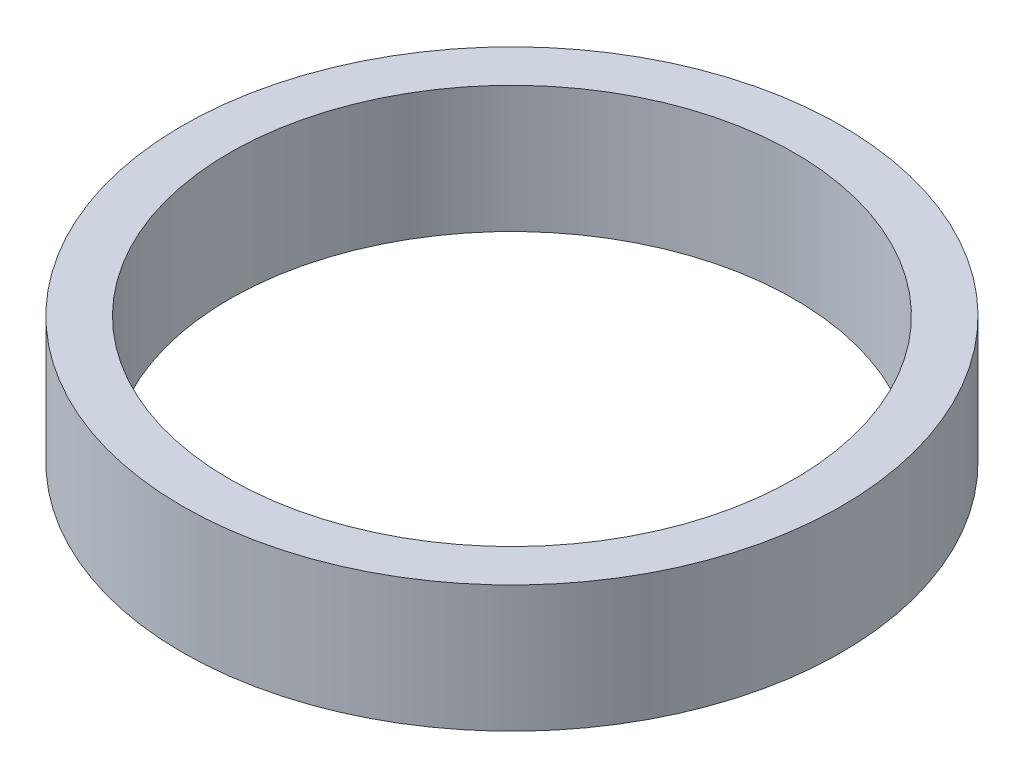
ISO-10303-21;
HEADER;
FILE_DESCRIPTION(('STEP AP214'),'2;1');
FILE_NAME('part.step','',(''),(''),'','','');
FILE_SCHEMA(('AUTOMOTIVE_DESIGN { 1 0 10303 214 1 1 1 1 }'));
ENDSEC;
DATA;
#1=APPLICATION_CONTEXT('core data for automotive mechanical design processes');
#2=APPLICATION_PROTOCOL_DEFINITION('international standard','automotive_design',2000,#1);
#3=PRODUCT_CONTEXT('',#1,'mechanical');
#4=PRODUCT('Part','Part','',(#3));
#5=PRODUCT_RELATED_PRODUCT_CATEGORY('part','',(#4));
#6=PRODUCT_DEFINITION_FORMATION('','',#4);
#7=PRODUCT_DEFINITION_CONTEXT('part definition',#1,'design');
#8=PRODUCT_DEFINITION('design','',#6,#7);
#9=PRODUCT_DEFINITION_SHAPE('','',#8);
#10=(LENGTH_UNIT() NAMED_UNIT(*) SI_UNIT(.MILLI.,.METRE.));
#11=(NAMED_UNIT(*) PLANE_ANGLE_UNIT() SI_UNIT($,.RADIAN.));
#12=(NAMED_UNIT(*) SI_UNIT($,.STERADIAN.) SOLID_ANGLE_UNIT());
#13=UNCERTAINTY_MEASURE_WITH_UNIT(LENGTH_MEASURE(1.E-05),#10,'distance_accuracy_value','');
#14=(GEOMETRIC_REPRESENTATION_CONTEXT(3) GLOBAL_UNCERTAINTY_ASSIGNED_CONTEXT((#13)) GLOBAL_UNIT_ASSIGNED_CONTEXT((#10,
#11,#12)) REPRESENTATION_CONTEXT('',''));
#15=CARTESIAN_POINT('',(0.,0.,0.));
#16=DIRECTION('',(0.,0.,1.));
#17=DIRECTION('',(1.,0.,0.));
#18=AXIS2_PLACEMENT_3D('',#15,#16,#17);
#19=CARTESIAN_POINT('',(0.,0.,0.));
#20=DIRECTION('',(0.,1.,0.));
#21=DIRECTION('',(0.,0.,1.));
#22=AXIS2_PLACEMENT_3D('',#19,#20,#21);
#23=CYLINDRICAL_SURFACE('',#22,6.);
#24=CARTESIAN_POINT('',(0.,4.25,0.));
#25=DIRECTION('',(0.,1.,0.));
#26=DIRECTION('',(0.,0.,1.));
#27=AXIS2_PLACEMENT_3D('',#24,#25,#26);
#28=CIRCLE('',#27,6.);
#29=CARTESIAN_POINT('',(0.,4.25,6.));
#30=VERTEX_POINT('',#29);
#31=EDGE_CURVE('E45',#30,#30,#28,.T.);
#32=ORIENTED_EDGE('',*,*,#31,.T.);
#33=EDGE_LOOP('',(#32));
#34=FACE_BOUND('',#33,.T.);
#35=CARTESIAN_POINT('',(0.,1.56000000000001,0.));
#36=DIRECTION('',(0.,1.,0.));
#37=DIRECTION('',(0.,0.,1.));
#38=AXIS2_PLACEMENT_3D('',#35,#36,#37);
#39=CIRCLE('',#38,6.);
#40=CARTESIAN_POINT('',(0.,1.56000000000001,6.));
#41=VERTEX_POINT('',#40);
#42=EDGE_CURVE('E10',#41,#41,#39,.T.);
#43=ORIENTED_EDGE('',*,*,#42,.F.);
#44=EDGE_LOOP('',(#43));
#45=FACE_BOUND('',#44,.T.);
#46=ADVANCED_FACE('F31',(#34,#45),#23,.F.);
#47=CARTESIAN_POINT('',(-6.,1.56000000000001,0.));
#48=DIRECTION('',(0.,-1.,0.));
#49=DIRECTION('',(0.,0.,-1.));
#50=AXIS2_PLACEMENT_3D('',#47,#48,#49);
#51=PLANE('',#50);
#52=ORIENTED_EDGE('',*,*,#42,.T.);
#53=EDGE_LOOP('',(#52));
#54=FACE_BOUND('',#53,.T.);
#55=CARTESIAN_POINT('',(0.,1.56000000000001,0.));
#56=DIRECTION('',(0.,1.,0.));
#57=DIRECTION('',(0.,0.,1.));
#58=AXIS2_PLACEMENT_3D('',#55,#56,#57);
#59=CIRCLE('',#58,7.);
#60=CARTESIAN_POINT('',(0.,1.56000000000001,7.));
#61=VERTEX_POINT('',#60);
#62=EDGE_CURVE('E37',#61,#61,#59,.T.);
#63=ORIENTED_EDGE('',*,*,#62,.F.);
#64=EDGE_LOOP('',(#63));
#65=FACE_BOUND('',#64,.T.);
#66=ADVANCED_FACE('F61',(#54,#65),#51,.T.);
#67=CARTESIAN_POINT('',(0.,0.,0.));
#68=DIRECTION('',(0.,1.,0.));
#69=DIRECTION('',(0.,0.,1.));
#70=AXIS2_PLACEMENT_3D('',#67,#68,#69);
#71=CYLINDRICAL_SURFACE('',#70,7.);
#72=ORIENTED_EDGE('',*,*,#62,.T.);
#73=EDGE_LOOP('',(#72));
#74=FACE_BOUND('',#73,.T.);
#75=CARTESIAN_POINT('',(0.,4.25,0.));
#76=DIRECTION('',(0.,1.,0.));
#77=DIRECTION('',(0.,0.,1.));
#78=AXIS2_PLACEMENT_3D('',#75,#76,#77);
#79=CIRCLE('',#78,7.);
#80=CARTESIAN_POINT('',(0.,4.25,7.));
#81=VERTEX_POINT('',#80);
#82=EDGE_CURVE('E41',#81,#81,#79,.T.);
#83=ORIENTED_EDGE('',*,*,#82,.F.);
#84=EDGE_LOOP('',(#83));
#85=FACE_BOUND('',#84,.T.);
#86=ADVANCED_FACE('F55',(#74,#85),#71,.T.);
#87=CARTESIAN_POINT('',(-6.,4.25,0.));
#88=DIRECTION('',(0.,1.,0.));
#89=DIRECTION('',(0.,0.,1.));
#90=AXIS2_PLACEMENT_3D('',#87,#88,#89);
#91=PLANE('',#90);
#92=ORIENTED_EDGE('',*,*,#82,.T.);
#93=EDGE_LOOP('',(#92));
#94=FACE_BOUND('',#93,.T.);
#95=ORIENTED_EDGE('',*,*,#31,.F.);
#96=EDGE_LOOP('',(#95));
#97=FACE_BOUND('',#96,.T.);
#98=ADVANCED_FACE('F53',(#94,#97),#91,.T.);
#99=CLOSED_SHELL('',(#46,#66,#86,#98));
#100=MANIFOLD_SOLID_BREP('B2',#99);
#101=ADVANCED_BREP_SHAPE_REPRESENTATION('',(#18,#100),#14);
#102=SHAPE_DEFINITION_REPRESENTATION(#9,#101);
ENDSEC;
END-ISO-10303-21;
